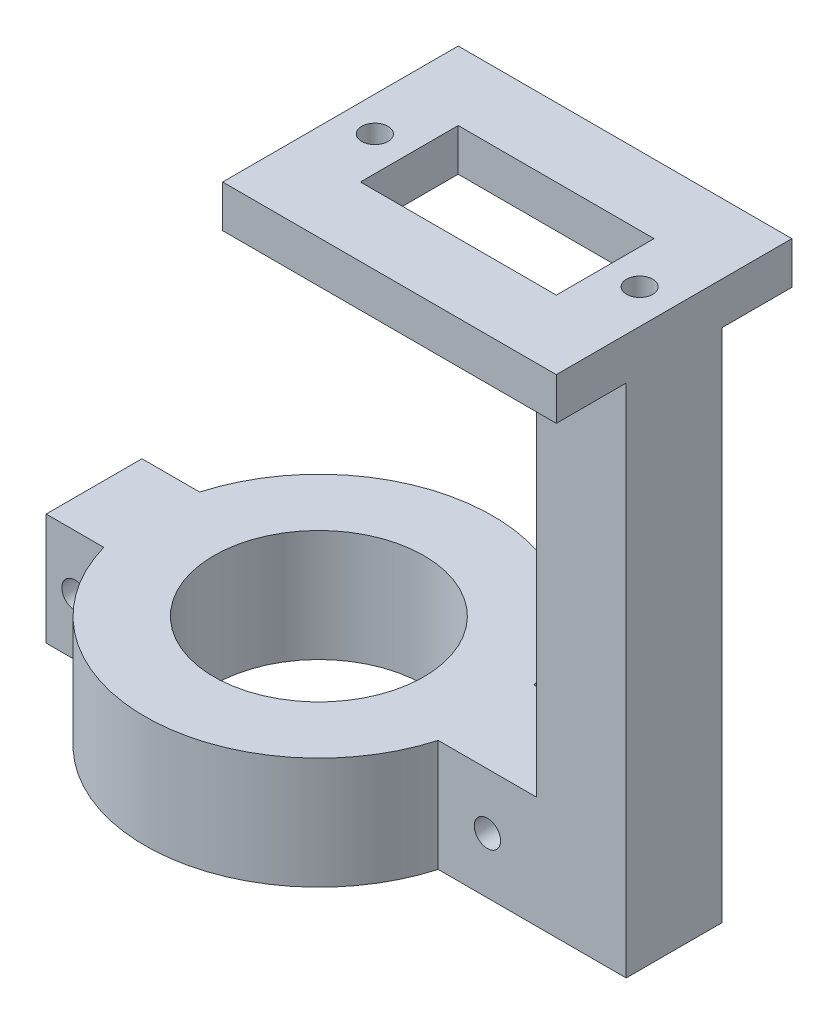
ISO-10303-21;
HEADER;
FILE_DESCRIPTION(('STEP AP214'),'2;1');
FILE_NAME('part.step','',(''),(''),'','','');
FILE_SCHEMA(('AUTOMOTIVE_DESIGN { 1 0 10303 214 1 1 1 1 }'));
ENDSEC;
DATA;
#1=APPLICATION_CONTEXT('core data for automotive mechanical design processes');
#2=APPLICATION_PROTOCOL_DEFINITION('international standard','automotive_design',2000,#1);
#3=PRODUCT_CONTEXT('',#1,'mechanical');
#4=PRODUCT('Part','Part','',(#3));
#5=PRODUCT_RELATED_PRODUCT_CATEGORY('part','',(#4));
#6=PRODUCT_DEFINITION_FORMATION('','',#4);
#7=PRODUCT_DEFINITION_CONTEXT('part definition',#1,'design');
#8=PRODUCT_DEFINITION('design','',#6,#7);
#9=PRODUCT_DEFINITION_SHAPE('','',#8);
#10=(LENGTH_UNIT() NAMED_UNIT(*) SI_UNIT(.MILLI.,.METRE.));
#11=(NAMED_UNIT(*) PLANE_ANGLE_UNIT() SI_UNIT($,.RADIAN.));
#12=(NAMED_UNIT(*) SI_UNIT($,.STERADIAN.) SOLID_ANGLE_UNIT());
#13=UNCERTAINTY_MEASURE_WITH_UNIT(LENGTH_MEASURE(1.E-05),#10,'distance_accuracy_value','');
#14=(GEOMETRIC_REPRESENTATION_CONTEXT(3) GLOBAL_UNCERTAINTY_ASSIGNED_CONTEXT((#13)) GLOBAL_UNIT_ASSIGNED_CONTEXT((#10,
#11,#12)) REPRESENTATION_CONTEXT('',''));
#15=CARTESIAN_POINT('',(0.,0.,0.));
#16=DIRECTION('',(0.,0.,1.));
#17=DIRECTION('',(1.,0.,0.));
#18=AXIS2_PLACEMENT_3D('',#15,#16,#17);
#19=CARTESIAN_POINT('',(-27.351479578733,-58.59,0.));
#20=DIRECTION('',(0.,-1.,0.));
#21=DIRECTION('',(0.,0.,-1.));
#22=AXIS2_PLACEMENT_3D('',#19,#20,#21);
#23=CYLINDRICAL_SURFACE('',#22,25.25);
#24=CARTESIAN_POINT('',(-27.351479578733,-74.82,0.));
#25=DIRECTION('',(0.,-1.,0.));
#26=DIRECTION('',(1.,0.,0.));
#27=AXIS2_PLACEMENT_3D('',#24,#25,#26);
#28=CIRCLE('',#27,25.25);
#29=CARTESIAN_POINT('',(-51.6247256533725,-74.82,-6.955));
#30=VERTEX_POINT('',#29);
#31=CARTESIAN_POINT('',(-3.07823350409353,-74.82,-6.955));
#32=VERTEX_POINT('',#31);
#33=EDGE_CURVE('E266',#30,#32,#28,.T.);
#34=ORIENTED_EDGE('',*,*,#33,.F.);
#35=DIRECTION('',(0.,-1.,0.));
#36=VECTOR('',#35,1.);
#37=CARTESIAN_POINT('',(-51.6247256533725,-58.59,-6.955));
#38=LINE('',#37,#36);
#39=CARTESIAN_POINT('',(-51.6247256533725,-58.59,-6.955));
#40=VERTEX_POINT('',#39);
#41=EDGE_CURVE('E12',#30,#40,#38,.F.);
#42=ORIENTED_EDGE('',*,*,#41,.T.);
#43=CARTESIAN_POINT('',(-27.351479578733,-58.59,0.));
#44=DIRECTION('',(0.,-1.,0.));
#45=DIRECTION('',(1.,0.,0.));
#46=AXIS2_PLACEMENT_3D('',#43,#44,#45);
#47=CIRCLE('',#46,25.25);
#48=CARTESIAN_POINT('',(-3.07823350409353,-58.59,-6.95500000000001));
#49=VERTEX_POINT('',#48);
#50=EDGE_CURVE('E273',#40,#49,#47,.T.);
#51=ORIENTED_EDGE('',*,*,#50,.T.);
#52=DIRECTION('',(0.,-1.,0.));
#53=VECTOR('',#52,1.);
#54=CARTESIAN_POINT('',(-3.07823350409353,-58.59,-6.955));
#55=LINE('',#54,#53);
#56=EDGE_CURVE('E278',#32,#49,#55,.F.);
#57=ORIENTED_EDGE('',*,*,#56,.F.);
#58=EDGE_LOOP('',(#34,#42,#51,#57));
#59=FACE_BOUND('',#58,.T.);
#60=ADVANCED_FACE('F63',(#59),#23,.T.);
#61=CARTESIAN_POINT('',(-3.07823350409353,-58.59,6.95499999999999));
#62=VERTEX_POINT('',#61);
#63=CARTESIAN_POINT('',(-51.6247256533725,-58.59,6.955));
#64=VERTEX_POINT('',#63);
#65=EDGE_CURVE('E269',#62,#64,#47,.T.);
#66=ORIENTED_EDGE('',*,*,#65,.T.);
#67=DIRECTION('',(0.,-1.,0.));
#68=VECTOR('',#67,1.);
#69=CARTESIAN_POINT('',(-51.6247256533725,-58.59,6.955));
#70=LINE('',#69,#68);
#71=CARTESIAN_POINT('',(-51.6247256533725,-74.82,6.955));
#72=VERTEX_POINT('',#71);
#73=EDGE_CURVE('E72',#64,#72,#70,.T.);
#74=ORIENTED_EDGE('',*,*,#73,.T.);
#75=CARTESIAN_POINT('',(-3.07823350409353,-74.82,6.955));
#76=VERTEX_POINT('',#75);
#77=EDGE_CURVE('E274',#76,#72,#28,.T.);
#78=ORIENTED_EDGE('',*,*,#77,.F.);
#79=DIRECTION('',(0.,-1.,0.));
#80=VECTOR('',#79,1.);
#81=CARTESIAN_POINT('',(-3.07823350409353,-58.59,6.955));
#82=LINE('',#81,#80);
#83=EDGE_CURVE('E272',#62,#76,#82,.T.);
#84=ORIENTED_EDGE('',*,*,#83,.F.);
#85=EDGE_LOOP('',(#66,#74,#78,#84));
#86=FACE_BOUND('',#85,.T.);
#87=ADVANCED_FACE('F404',(#86),#23,.T.);
#88=CARTESIAN_POINT('',(11.225,-74.82,6.955));
#89=DIRECTION('',(1.,0.,0.));
#90=DIRECTION('',(0.,0.,-1.));
#91=AXIS2_PLACEMENT_3D('',#88,#89,#90);
#92=PLANE('',#91);
#93=DIRECTION('',(0.,0.,-1.));
#94=VECTOR('',#93,1.);
#95=CARTESIAN_POINT('',(11.225,-58.59,-6.955));
#96=LINE('',#95,#94);
#97=CARTESIAN_POINT('',(11.225,-58.59,6.955));
#98=VERTEX_POINT('',#97);
#99=CARTESIAN_POINT('',(11.225,-58.59,-6.955));
#100=VERTEX_POINT('',#99);
#101=EDGE_CURVE('E281',#98,#100,#96,.T.);
#102=ORIENTED_EDGE('',*,*,#101,.F.);
#103=DIRECTION('',(0.,1.,0.));
#104=VECTOR('',#103,1.);
#105=CARTESIAN_POINT('',(11.225,-74.82,6.955));
#106=LINE('',#105,#104);
#107=CARTESIAN_POINT('',(11.225,0.,6.955));
#108=VERTEX_POINT('',#107);
#109=EDGE_CURVE('E308',#98,#108,#106,.T.);
#110=ORIENTED_EDGE('',*,*,#109,.T.);
#111=DIRECTION('',(0.,0.,-1.));
#112=VECTOR('',#111,1.);
#113=CARTESIAN_POINT('',(11.225,0.,6.955));
#114=LINE('',#113,#112);
#115=CARTESIAN_POINT('',(11.225,0.,-6.955));
#116=VERTEX_POINT('',#115);
#117=EDGE_CURVE('E301',#108,#116,#114,.T.);
#118=ORIENTED_EDGE('',*,*,#117,.T.);
#119=DIRECTION('',(0.,1.,0.));
#120=VECTOR('',#119,1.);
#121=CARTESIAN_POINT('',(11.225,-74.82,-6.955));
#122=LINE('',#121,#120);
#123=EDGE_CURVE('E306',#100,#116,#122,.T.);
#124=ORIENTED_EDGE('',*,*,#123,.F.);
#125=EDGE_LOOP('',(#102,#110,#118,#124));
#126=FACE_BOUND('',#125,.T.);
#127=ADVANCED_FACE('F394',(#126),#92,.F.);
#128=CARTESIAN_POINT('',(0.,0.,0.));
#129=DIRECTION('',(0.,1.,0.));
#130=DIRECTION('',(0.,0.,1.));
#131=AXIS2_PLACEMENT_3D('',#128,#129,#130);
#132=PLANE('',#131);
#133=CARTESIAN_POINT('',(-19.225,0.,0.));
#134=DIRECTION('',(0.,1.,0.));
#135=DIRECTION('',(0.,0.,1.));
#136=AXIS2_PLACEMENT_3D('',#133,#134,#135);
#137=CIRCLE('',#136,1.91);
#138=CARTESIAN_POINT('',(-19.225,0.,1.91));
#139=VERTEX_POINT('',#138);
#140=EDGE_CURVE('E316',#139,#139,#137,.T.);
#141=ORIENTED_EDGE('',*,*,#140,.T.);
#142=EDGE_LOOP('',(#141));
#143=FACE_BOUND('',#142,.T.);
#144=DIRECTION('',(1.,0.,0.));
#145=VECTOR('',#144,1.);
#146=CARTESIAN_POINT('',(11.225,0.,-6.955));
#147=LINE('',#146,#145);
#148=CARTESIAN_POINT('',(14.225,0.,-6.955));
#149=VERTEX_POINT('',#148);
#150=CARTESIAN_POINT('',(24.225,0.,-6.955));
#151=VERTEX_POINT('',#150);
#152=EDGE_CURVE('E214',#149,#151,#147,.T.);
#153=ORIENTED_EDGE('',*,*,#152,.F.);
#154=DIRECTION('',(0.,0.,-1.));
#155=VECTOR('',#154,1.);
#156=CARTESIAN_POINT('',(14.225,0.,-7.1));
#157=LINE('',#156,#155);
#158=CARTESIAN_POINT('',(14.225,0.,-7.1));
#159=VERTEX_POINT('',#158);
#160=EDGE_CURVE('E319',#149,#159,#157,.T.);
#161=ORIENTED_EDGE('',*,*,#160,.T.);
#162=DIRECTION('',(-1.,0.,0.));
#163=VECTOR('',#162,1.);
#164=CARTESIAN_POINT('',(-14.225,0.,-7.1));
#165=LINE('',#164,#163);
#166=CARTESIAN_POINT('',(-14.225,0.,-7.1));
#167=VERTEX_POINT('',#166);
#168=EDGE_CURVE('E322',#159,#167,#165,.T.);
#169=ORIENTED_EDGE('',*,*,#168,.T.);
#170=DIRECTION('',(0.,0.,1.));
#171=VECTOR('',#170,1.);
#172=CARTESIAN_POINT('',(-14.225,0.,-7.1));
#173=LINE('',#172,#171);
#174=CARTESIAN_POINT('',(-14.225,0.,7.1));
#175=VERTEX_POINT('',#174);
#176=EDGE_CURVE('E326',#167,#175,#173,.T.);
#177=ORIENTED_EDGE('',*,*,#176,.T.);
#178=DIRECTION('',(1.,0.,0.));
#179=VECTOR('',#178,1.);
#180=CARTESIAN_POINT('',(-14.225,0.,7.1));
#181=LINE('',#180,#179);
#182=CARTESIAN_POINT('',(14.225,0.,7.1));
#183=VERTEX_POINT('',#182);
#184=EDGE_CURVE('E329',#175,#183,#181,.T.);
#185=ORIENTED_EDGE('',*,*,#184,.T.);
#186=CARTESIAN_POINT('',(14.225,0.,6.955));
#187=VERTEX_POINT('',#186);
#188=EDGE_CURVE('E320',#183,#187,#157,.T.);
#189=ORIENTED_EDGE('',*,*,#188,.T.);
#190=DIRECTION('',(-1.,0.,0.));
#191=VECTOR('',#190,1.);
#192=CARTESIAN_POINT('',(11.225,0.,6.955));
#193=LINE('',#192,#191);
#194=CARTESIAN_POINT('',(24.225,0.,6.955));
#195=VERTEX_POINT('',#194);
#196=EDGE_CURVE('E298',#195,#187,#193,.T.);
#197=ORIENTED_EDGE('',*,*,#196,.F.);
#198=DIRECTION('',(0.,0.,-1.));
#199=VECTOR('',#198,1.);
#200=CARTESIAN_POINT('',(24.225,0.,-7.1));
#201=LINE('',#200,#199);
#202=CARTESIAN_POINT('',(24.225,0.,17.1));
#203=VERTEX_POINT('',#202);
#204=EDGE_CURVE('E340',#203,#195,#201,.T.);
#205=ORIENTED_EDGE('',*,*,#204,.F.);
#206=DIRECTION('',(1.,0.,0.));
#207=VECTOR('',#206,1.);
#208=CARTESIAN_POINT('',(-14.225,0.,17.1));
#209=LINE('',#208,#207);
#210=CARTESIAN_POINT('',(-24.225,0.,17.1));
#211=VERTEX_POINT('',#210);
#212=EDGE_CURVE('E348',#211,#203,#209,.T.);
#213=ORIENTED_EDGE('',*,*,#212,.F.);
#214=DIRECTION('',(0.,0.,1.));
#215=VECTOR('',#214,1.);
#216=CARTESIAN_POINT('',(-24.225,0.,-7.1));
#217=LINE('',#216,#215);
#218=CARTESIAN_POINT('',(-24.225,0.,-17.1));
#219=VERTEX_POINT('',#218);
#220=EDGE_CURVE('E345',#219,#211,#217,.T.);
#221=ORIENTED_EDGE('',*,*,#220,.F.);
#222=DIRECTION('',(-1.,0.,0.));
#223=VECTOR('',#222,1.);
#224=CARTESIAN_POINT('',(-14.225,0.,-17.1));
#225=LINE('',#224,#223);
#226=CARTESIAN_POINT('',(24.225,0.,-17.1));
#227=VERTEX_POINT('',#226);
#228=EDGE_CURVE('E343',#227,#219,#225,.T.);
#229=ORIENTED_EDGE('',*,*,#228,.F.);
#230=EDGE_CURVE('E212',#151,#227,#201,.T.);
#231=ORIENTED_EDGE('',*,*,#230,.F.);
#232=EDGE_LOOP('',(#153,#161,#169,#177,#185,#189,#197,#205,#213,#221,#229,#231));
#233=FACE_BOUND('',#232,.T.);
#234=ADVANCED_FACE('F361',(#143,#233),#132,.F.);
#235=CARTESIAN_POINT('',(24.225,12.25,-7.1));
#236=DIRECTION('',(-1.,0.,0.));
#237=DIRECTION('',(0.,0.,1.));
#238=AXIS2_PLACEMENT_3D('',#235,#236,#237);
#239=PLANE('',#238);
#240=DIRECTION('',(0.,-1.,0.));
#241=VECTOR('',#240,1.);
#242=CARTESIAN_POINT('',(24.225,12.25,-17.1));
#243=LINE('',#242,#241);
#244=CARTESIAN_POINT('',(24.225,6.125,-17.1));
#245=VERTEX_POINT('',#244);
#246=EDGE_CURVE('E200',#245,#227,#243,.T.);
#247=ORIENTED_EDGE('',*,*,#246,.F.);
#248=DIRECTION('',(0.,0.,1.));
#249=VECTOR('',#248,1.);
#250=CARTESIAN_POINT('',(24.225,6.125,-7.1));
#251=LINE('',#250,#249);
#252=CARTESIAN_POINT('',(24.225,6.125,17.1));
#253=VERTEX_POINT('',#252);
#254=EDGE_CURVE('E203',#245,#253,#251,.T.);
#255=ORIENTED_EDGE('',*,*,#254,.T.);
#256=DIRECTION('',(0.,-1.,0.));
#257=VECTOR('',#256,1.);
#258=CARTESIAN_POINT('',(24.225,12.25,17.1));
#259=LINE('',#258,#257);
#260=EDGE_CURVE('E351',#253,#203,#259,.T.);
#261=ORIENTED_EDGE('',*,*,#260,.T.);
#262=ORIENTED_EDGE('',*,*,#204,.T.);
#263=DIRECTION('',(0.,1.,0.));
#264=VECTOR('',#263,1.);
#265=CARTESIAN_POINT('',(24.225,-74.82,6.955));
#266=LINE('',#265,#264);
#267=CARTESIAN_POINT('',(24.225,-74.82,6.955));
#268=VERTEX_POINT('',#267);
#269=EDGE_CURVE('E310',#268,#195,#266,.T.);
#270=ORIENTED_EDGE('',*,*,#269,.F.);
#271=DIRECTION('',(0.,0.,1.));
#272=VECTOR('',#271,1.);
#273=CARTESIAN_POINT('',(24.225,-74.82,6.955));
#274=LINE('',#273,#272);
#275=CARTESIAN_POINT('',(24.225,-74.82,-6.955));
#276=VERTEX_POINT('',#275);
#277=EDGE_CURVE('E289',#276,#268,#274,.T.);
#278=ORIENTED_EDGE('',*,*,#277,.F.);
#279=DIRECTION('',(0.,1.,0.));
#280=VECTOR('',#279,1.);
#281=CARTESIAN_POINT('',(24.225,-74.82,-6.955));
#282=LINE('',#281,#280);
#283=EDGE_CURVE('E297',#276,#151,#282,.T.);
#284=ORIENTED_EDGE('',*,*,#283,.T.);
#285=ORIENTED_EDGE('',*,*,#230,.T.);
#286=EDGE_LOOP('',(#247,#255,#261,#262,#270,#278,#284,#285));
#287=FACE_BOUND('',#286,.T.);
#288=ADVANCED_FACE('F65',(#287),#239,.F.);
#289=CARTESIAN_POINT('',(-14.225,12.25,-17.1));
#290=DIRECTION('',(0.,0.,1.));
#291=DIRECTION('',(1.,0.,0.));
#292=AXIS2_PLACEMENT_3D('',#289,#290,#291);
#293=PLANE('',#292);
#294=DIRECTION('',(-1.,0.,0.));
#295=VECTOR('',#294,1.);
#296=CARTESIAN_POINT('',(24.2045446236148,6.125,-17.1));
#297=LINE('',#296,#295);
#298=CARTESIAN_POINT('',(-24.225,6.125,-17.1));
#299=VERTEX_POINT('',#298);
#300=EDGE_CURVE('E195',#245,#299,#297,.T.);
#301=ORIENTED_EDGE('',*,*,#300,.F.);
#302=ORIENTED_EDGE('',*,*,#246,.T.);
#303=ORIENTED_EDGE('',*,*,#228,.T.);
#304=DIRECTION('',(0.,-1.,0.));
#305=VECTOR('',#304,1.);
#306=CARTESIAN_POINT('',(-24.225,12.25,-17.1));
#307=LINE('',#306,#305);
#308=EDGE_CURVE('E202',#299,#219,#307,.T.);
#309=ORIENTED_EDGE('',*,*,#308,.F.);
#310=EDGE_LOOP('',(#301,#302,#303,#309));
#311=FACE_BOUND('',#310,.T.);
#312=ADVANCED_FACE('F197',(#311),#293,.F.);
#313=CARTESIAN_POINT('',(-24.225,12.25,-7.1));
#314=DIRECTION('',(1.,0.,0.));
#315=DIRECTION('',(0.,0.,-1.));
#316=AXIS2_PLACEMENT_3D('',#313,#314,#315);
#317=PLANE('',#316);
#318=DIRECTION('',(0.,-1.,0.));
#319=VECTOR('',#318,1.);
#320=CARTESIAN_POINT('',(-24.225,12.25,17.1));
#321=LINE('',#320,#319);
#322=CARTESIAN_POINT('',(-24.225,6.125,17.1));
#323=VERTEX_POINT('',#322);
#324=EDGE_CURVE('E219',#323,#211,#321,.T.);
#325=ORIENTED_EDGE('',*,*,#324,.F.);
#326=DIRECTION('',(0.,0.,-1.));
#327=VECTOR('',#326,1.);
#328=CARTESIAN_POINT('',(-24.225,6.125,25.25));
#329=LINE('',#328,#327);
#330=EDGE_CURVE('E80',#323,#299,#329,.T.);
#331=ORIENTED_EDGE('',*,*,#330,.T.);
#332=ORIENTED_EDGE('',*,*,#308,.T.);
#333=ORIENTED_EDGE('',*,*,#220,.T.);
#334=EDGE_LOOP('',(#325,#331,#332,#333));
#335=FACE_BOUND('',#334,.T.);
#336=ADVANCED_FACE('F359',(#335),#317,.F.);
#337=CARTESIAN_POINT('',(-14.225,12.25,17.1));
#338=DIRECTION('',(0.,0.,-1.));
#339=DIRECTION('',(-1.,0.,0.));
#340=AXIS2_PLACEMENT_3D('',#337,#338,#339);
#341=PLANE('',#340);
#342=ORIENTED_EDGE('',*,*,#260,.F.);
#343=DIRECTION('',(-1.,0.,0.));
#344=VECTOR('',#343,1.);
#345=CARTESIAN_POINT('',(-14.225,6.125,17.1));
#346=LINE('',#345,#344);
#347=EDGE_CURVE('E207',#253,#323,#346,.T.);
#348=ORIENTED_EDGE('',*,*,#347,.T.);
#349=ORIENTED_EDGE('',*,*,#324,.T.);
#350=ORIENTED_EDGE('',*,*,#212,.T.);
#351=EDGE_LOOP('',(#342,#348,#349,#350));
#352=FACE_BOUND('',#351,.T.);
#353=ADVANCED_FACE('F354',(#352),#341,.F.);
#354=CARTESIAN_POINT('',(14.225,12.25,-7.1));
#355=DIRECTION('',(-1.,0.,0.));
#356=DIRECTION('',(0.,0.,1.));
#357=AXIS2_PLACEMENT_3D('',#354,#355,#356);
#358=PLANE('',#357);
#359=DIRECTION('',(0.,0.,1.));
#360=VECTOR('',#359,1.);
#361=CARTESIAN_POINT('',(14.225,6.125,-7.1));
#362=LINE('',#361,#360);
#363=CARTESIAN_POINT('',(14.225,6.125,-7.1));
#364=VERTEX_POINT('',#363);
#365=CARTESIAN_POINT('',(14.225,6.125,7.1));
#366=VERTEX_POINT('',#365);
#367=EDGE_CURVE('E88',#364,#366,#362,.T.);
#368=ORIENTED_EDGE('',*,*,#367,.F.);
#369=DIRECTION('',(0.,-1.,0.));
#370=VECTOR('',#369,1.);
#371=CARTESIAN_POINT('',(14.225,12.25,-7.1));
#372=LINE('',#371,#370);
#373=EDGE_CURVE('E338',#364,#159,#372,.T.);
#374=ORIENTED_EDGE('',*,*,#373,.T.);
#375=ORIENTED_EDGE('',*,*,#160,.F.);
#376=EDGE_CURVE('E323',#187,#149,#157,.T.);
#377=ORIENTED_EDGE('',*,*,#376,.F.);
#378=ORIENTED_EDGE('',*,*,#188,.F.);
#379=DIRECTION('',(0.,-1.,0.));
#380=VECTOR('',#379,1.);
#381=CARTESIAN_POINT('',(14.225,12.25,7.1));
#382=LINE('',#381,#380);
#383=EDGE_CURVE('E332',#366,#183,#382,.T.);
#384=ORIENTED_EDGE('',*,*,#383,.F.);
#385=EDGE_LOOP('',(#368,#374,#375,#377,#378,#384));
#386=FACE_BOUND('',#385,.T.);
#387=ADVANCED_FACE('F384',(#386),#358,.T.);
#388=CARTESIAN_POINT('',(-14.225,12.25,-7.1));
#389=DIRECTION('',(0.,0.,1.));
#390=DIRECTION('',(1.,0.,0.));
#391=AXIS2_PLACEMENT_3D('',#388,#389,#390);
#392=PLANE('',#391);
#393=DIRECTION('',(1.,0.,0.));
#394=VECTOR('',#393,1.);
#395=CARTESIAN_POINT('',(-14.225,6.125,-7.1));
#396=LINE('',#395,#394);
#397=CARTESIAN_POINT('',(-14.225,6.125,-7.1));
#398=VERTEX_POINT('',#397);
#399=EDGE_CURVE('E692',#398,#364,#396,.T.);
#400=ORIENTED_EDGE('',*,*,#399,.F.);
#401=DIRECTION('',(0.,-1.,0.));
#402=VECTOR('',#401,1.);
#403=CARTESIAN_POINT('',(-14.225,12.25,-7.1));
#404=LINE('',#403,#402);
#405=EDGE_CURVE('E336',#398,#167,#404,.T.);
#406=ORIENTED_EDGE('',*,*,#405,.T.);
#407=ORIENTED_EDGE('',*,*,#168,.F.);
#408=ORIENTED_EDGE('',*,*,#373,.F.);
#409=EDGE_LOOP('',(#400,#406,#407,#408));
#410=FACE_BOUND('',#409,.T.);
#411=ADVANCED_FACE('F458',(#410),#392,.T.);
#412=CARTESIAN_POINT('',(-14.225,12.25,-7.1));
#413=DIRECTION('',(1.,0.,0.));
#414=DIRECTION('',(0.,0.,-1.));
#415=AXIS2_PLACEMENT_3D('',#412,#413,#414);
#416=PLANE('',#415);
#417=DIRECTION('',(0.,0.,-1.));
#418=VECTOR('',#417,1.);
#419=CARTESIAN_POINT('',(-14.225,6.125,-7.1));
#420=LINE('',#419,#418);
#421=CARTESIAN_POINT('',(-14.225,6.125,7.1));
#422=VERTEX_POINT('',#421);
#423=EDGE_CURVE('E687',#422,#398,#420,.T.);
#424=ORIENTED_EDGE('',*,*,#423,.F.);
#425=DIRECTION('',(0.,-1.,0.));
#426=VECTOR('',#425,1.);
#427=CARTESIAN_POINT('',(-14.225,12.25,7.1));
#428=LINE('',#427,#426);
#429=EDGE_CURVE('E334',#422,#175,#428,.T.);
#430=ORIENTED_EDGE('',*,*,#429,.T.);
#431=ORIENTED_EDGE('',*,*,#176,.F.);
#432=ORIENTED_EDGE('',*,*,#405,.F.);
#433=EDGE_LOOP('',(#424,#430,#431,#432));
#434=FACE_BOUND('',#433,.T.);
#435=ADVANCED_FACE('F454',(#434),#416,.T.);
#436=CARTESIAN_POINT('',(-14.225,12.25,7.1));
#437=DIRECTION('',(0.,0.,-1.));
#438=DIRECTION('',(-1.,0.,0.));
#439=AXIS2_PLACEMENT_3D('',#436,#437,#438);
#440=PLANE('',#439);
#441=DIRECTION('',(-1.,0.,0.));
#442=VECTOR('',#441,1.);
#443=CARTESIAN_POINT('',(-14.225,6.125,7.1));
#444=LINE('',#443,#442);
#445=EDGE_CURVE('E685',#366,#422,#444,.T.);
#446=ORIENTED_EDGE('',*,*,#445,.F.);
#447=ORIENTED_EDGE('',*,*,#383,.T.);
#448=ORIENTED_EDGE('',*,*,#184,.F.);
#449=ORIENTED_EDGE('',*,*,#429,.F.);
#450=EDGE_LOOP('',(#446,#447,#448,#449));
#451=FACE_BOUND('',#450,.T.);
#452=ADVANCED_FACE('F450',(#451),#440,.T.);
#453=CARTESIAN_POINT('',(-19.225,0.,0.));
#454=DIRECTION('',(0.,1.,0.));
#455=DIRECTION('',(0.,0.,1.));
#456=AXIS2_PLACEMENT_3D('',#453,#454,#455);
#457=CYLINDRICAL_SURFACE('',#456,1.91);
#458=CARTESIAN_POINT('',(-19.225,6.125,0.));
#459=DIRECTION('',(0.,-1.,0.));
#460=DIRECTION('',(0.,0.,-1.));
#461=AXIS2_PLACEMENT_3D('',#458,#459,#460);
#462=CIRCLE('',#461,1.91);
#463=CARTESIAN_POINT('',(-19.225,6.125,-1.91));
#464=VERTEX_POINT('',#463);
#465=EDGE_CURVE('E684',#464,#464,#462,.F.);
#466=ORIENTED_EDGE('',*,*,#465,.T.);
#467=EDGE_LOOP('',(#466));
#468=FACE_BOUND('',#467,.T.);
#469=ORIENTED_EDGE('',*,*,#140,.F.);
#470=EDGE_LOOP('',(#469));
#471=FACE_BOUND('',#470,.T.);
#472=ADVANCED_FACE('F431',(#468,#471),#457,.F.);
#473=CARTESIAN_POINT('',(0.,-74.82,0.));
#474=DIRECTION('',(0.,-1.,0.));
#475=DIRECTION('',(0.,0.,-1.));
#476=AXIS2_PLACEMENT_3D('',#473,#474,#475);
#477=PLANE('',#476);
#478=DIRECTION('',(-1.,0.,0.));
#479=VECTOR('',#478,1.);
#480=CARTESIAN_POINT('',(-50.,-74.82,-6.955));
#481=LINE('',#480,#479);
#482=CARTESIAN_POINT('',(-60.,-74.82,-6.955));
#483=VERTEX_POINT('',#482);
#484=EDGE_CURVE('E253',#30,#483,#481,.T.);
#485=ORIENTED_EDGE('',*,*,#484,.F.);
#486=ORIENTED_EDGE('',*,*,#33,.T.);
#487=DIRECTION('',(1.,0.,0.));
#488=VECTOR('',#487,1.);
#489=CARTESIAN_POINT('',(11.225,-74.82,-6.955));
#490=LINE('',#489,#488);
#491=EDGE_CURVE('E295',#32,#276,#490,.T.);
#492=ORIENTED_EDGE('',*,*,#491,.T.);
#493=ORIENTED_EDGE('',*,*,#277,.T.);
#494=DIRECTION('',(-1.,0.,0.));
#495=VECTOR('',#494,1.);
#496=CARTESIAN_POINT('',(11.225,-74.82,6.955));
#497=LINE('',#496,#495);
#498=EDGE_CURVE('E292',#268,#76,#497,.T.);
#499=ORIENTED_EDGE('',*,*,#498,.T.);
#500=ORIENTED_EDGE('',*,*,#77,.T.);
#501=DIRECTION('',(-1.,0.,0.));
#502=VECTOR('',#501,1.);
#503=CARTESIAN_POINT('',(-50.,-74.82,6.955));
#504=LINE('',#503,#502);
#505=CARTESIAN_POINT('',(-60.,-74.82,6.955));
#506=VERTEX_POINT('',#505);
#507=EDGE_CURVE('E255',#72,#506,#504,.T.);
#508=ORIENTED_EDGE('',*,*,#507,.T.);
#509=DIRECTION('',(0.,0.,-1.));
#510=VECTOR('',#509,1.);
#511=CARTESIAN_POINT('',(-60.,-74.82,-6.955));
#512=LINE('',#511,#510);
#513=EDGE_CURVE('E250',#506,#483,#512,.T.);
#514=ORIENTED_EDGE('',*,*,#513,.T.);
#515=EDGE_LOOP('',(#485,#486,#492,#493,#499,#500,#508,#514));
#516=FACE_BOUND('',#515,.T.);
#517=CARTESIAN_POINT('',(-27.351479578733,-74.82,0.));
#518=DIRECTION('',(0.,-1.,0.));
#519=DIRECTION('',(0.,0.,-1.));
#520=AXIS2_PLACEMENT_3D('',#517,#518,#519);
#521=CIRCLE('',#520,15.25);
#522=CARTESIAN_POINT('',(-27.351479578733,-74.82,-15.25));
#523=VERTEX_POINT('',#522);
#524=EDGE_CURVE('E226',#523,#523,#521,.T.);
#525=ORIENTED_EDGE('',*,*,#524,.F.);
#526=EDGE_LOOP('',(#525));
#527=FACE_BOUND('',#526,.T.);
#528=ADVANCED_FACE('F370',(#516,#527),#477,.T.);
#529=CARTESIAN_POINT('',(11.225,-74.82,-6.955));
#530=DIRECTION('',(0.,0.,1.));
#531=DIRECTION('',(1.,0.,0.));
#532=AXIS2_PLACEMENT_3D('',#529,#530,#531);
#533=PLANE('',#532);
#534=CARTESIAN_POINT('',(4.07338324795324,-66.705,-6.955));
#535=DIRECTION('',(0.,0.,-1.));
#536=DIRECTION('',(-1.,0.,0.));
#537=AXIS2_PLACEMENT_3D('',#534,#535,#536);
#538=CIRCLE('',#537,1.91);
#539=CARTESIAN_POINT('',(2.16338324795324,-66.705,-6.955));
#540=VERTEX_POINT('',#539);
#541=EDGE_CURVE('E227',#540,#540,#538,.T.);
#542=ORIENTED_EDGE('',*,*,#541,.F.);
#543=EDGE_LOOP('',(#542));
#544=FACE_BOUND('',#543,.T.);
#545=ORIENTED_EDGE('',*,*,#491,.F.);
#546=ORIENTED_EDGE('',*,*,#56,.T.);
#547=DIRECTION('',(1.,0.,0.));
#548=VECTOR('',#547,1.);
#549=CARTESIAN_POINT('',(-4.77499999999998,-58.59,-6.95500000000001));
#550=LINE('',#549,#548);
#551=EDGE_CURVE('E284',#49,#100,#550,.T.);
#552=ORIENTED_EDGE('',*,*,#551,.T.);
#553=ORIENTED_EDGE('',*,*,#123,.T.);
#554=EDGE_CURVE('E218',#116,#149,#147,.T.);
#555=ORIENTED_EDGE('',*,*,#554,.T.);
#556=ORIENTED_EDGE('',*,*,#152,.T.);
#557=ORIENTED_EDGE('',*,*,#283,.F.);
#558=EDGE_LOOP('',(#545,#546,#552,#553,#555,#556,#557));
#559=FACE_BOUND('',#558,.T.);
#560=ADVANCED_FACE('F375',(#544,#559),#533,.F.);
#561=CARTESIAN_POINT('',(11.225,-74.82,6.955));
#562=DIRECTION('',(0.,0.,-1.));
#563=DIRECTION('',(-1.,0.,0.));
#564=AXIS2_PLACEMENT_3D('',#561,#562,#563);
#565=PLANE('',#564);
#566=CARTESIAN_POINT('',(4.07338324795324,-66.705,6.955));
#567=DIRECTION('',(0.,0.,-1.));
#568=DIRECTION('',(-1.,0.,0.));
#569=AXIS2_PLACEMENT_3D('',#566,#567,#568);
#570=CIRCLE('',#569,1.91);
#571=CARTESIAN_POINT('',(2.16338324795324,-66.705,6.955));
#572=VERTEX_POINT('',#571);
#573=EDGE_CURVE('E223',#572,#572,#570,.T.);
#574=ORIENTED_EDGE('',*,*,#573,.T.);
#575=EDGE_LOOP('',(#574));
#576=FACE_BOUND('',#575,.T.);
#577=DIRECTION('',(1.,0.,0.));
#578=VECTOR('',#577,1.);
#579=CARTESIAN_POINT('',(-4.77499999999999,-58.59,6.95499999999999));
#580=LINE('',#579,#578);
#581=EDGE_CURVE('E286',#62,#98,#580,.T.);
#582=ORIENTED_EDGE('',*,*,#581,.F.);
#583=ORIENTED_EDGE('',*,*,#83,.T.);
#584=ORIENTED_EDGE('',*,*,#498,.F.);
#585=ORIENTED_EDGE('',*,*,#269,.T.);
#586=ORIENTED_EDGE('',*,*,#196,.T.);
#587=EDGE_CURVE('E288',#187,#108,#193,.T.);
#588=ORIENTED_EDGE('',*,*,#587,.T.);
#589=ORIENTED_EDGE('',*,*,#109,.F.);
#590=EDGE_LOOP('',(#582,#583,#584,#585,#586,#588,#589));
#591=FACE_BOUND('',#590,.T.);
#592=ADVANCED_FACE('F365',(#576,#591),#565,.F.);
#593=CARTESIAN_POINT('',(0.,0.,0.));
#594=DIRECTION('',(0.,-1.,0.));
#595=DIRECTION('',(0.,0.,-1.));
#596=AXIS2_PLACEMENT_3D('',#593,#594,#595);
#597=PLANE('',#596);
#598=ORIENTED_EDGE('',*,*,#587,.F.);
#599=ORIENTED_EDGE('',*,*,#376,.T.);
#600=ORIENTED_EDGE('',*,*,#554,.F.);
#601=ORIENTED_EDGE('',*,*,#117,.F.);
#602=EDGE_LOOP('',(#598,#599,#600,#601));
#603=FACE_BOUND('',#602,.T.);
#604=ADVANCED_FACE('F389',(#603),#597,.F.);
#605=CARTESIAN_POINT('',(-4.77499999999998,-58.59,-6.95500000000001));
#606=DIRECTION('',(0.,-1.,0.));
#607=DIRECTION('',(0.,0.,-1.));
#608=AXIS2_PLACEMENT_3D('',#605,#606,#607);
#609=PLANE('',#608);
#610=ORIENTED_EDGE('',*,*,#50,.F.);
#611=DIRECTION('',(-1.,0.,0.));
#612=VECTOR('',#611,1.);
#613=CARTESIAN_POINT('',(-50.,-58.59,-6.955));
#614=LINE('',#613,#612);
#615=CARTESIAN_POINT('',(-60.,-58.59,-6.955));
#616=VERTEX_POINT('',#615);
#617=EDGE_CURVE('E259',#40,#616,#614,.T.);
#618=ORIENTED_EDGE('',*,*,#617,.T.);
#619=DIRECTION('',(0.,0.,1.));
#620=VECTOR('',#619,1.);
#621=CARTESIAN_POINT('',(-60.,-58.59,-6.955));
#622=LINE('',#621,#620);
#623=CARTESIAN_POINT('',(-60.,-58.59,6.955));
#624=VERTEX_POINT('',#623);
#625=EDGE_CURVE('E236',#616,#624,#622,.T.);
#626=ORIENTED_EDGE('',*,*,#625,.T.);
#627=DIRECTION('',(-1.,0.,0.));
#628=VECTOR('',#627,1.);
#629=CARTESIAN_POINT('',(-50.,-58.59,6.955));
#630=LINE('',#629,#628);
#631=EDGE_CURVE('E257',#64,#624,#630,.T.);
#632=ORIENTED_EDGE('',*,*,#631,.F.);
#633=ORIENTED_EDGE('',*,*,#65,.F.);
#634=ORIENTED_EDGE('',*,*,#581,.T.);
#635=ORIENTED_EDGE('',*,*,#101,.T.);
#636=ORIENTED_EDGE('',*,*,#551,.F.);
#637=EDGE_LOOP('',(#610,#618,#626,#632,#633,#634,#635,#636));
#638=FACE_BOUND('',#637,.T.);
#639=CARTESIAN_POINT('',(-27.351479578733,-58.59,0.));
#640=DIRECTION('',(0.,-1.,0.));
#641=DIRECTION('',(0.,0.,-1.));
#642=AXIS2_PLACEMENT_3D('',#639,#640,#641);
#643=CIRCLE('',#642,15.25);
#644=CARTESIAN_POINT('',(-27.351479578733,-58.59,-15.25));
#645=VERTEX_POINT('',#644);
#646=EDGE_CURVE('E263',#645,#645,#643,.T.);
#647=ORIENTED_EDGE('',*,*,#646,.T.);
#648=EDGE_LOOP('',(#647));
#649=FACE_BOUND('',#648,.T.);
#650=ADVANCED_FACE('F399',(#638,#649),#609,.F.);
#651=CARTESIAN_POINT('',(-27.351479578733,-58.59,0.));
#652=DIRECTION('',(0.,-1.,0.));
#653=DIRECTION('',(0.,0.,-1.));
#654=AXIS2_PLACEMENT_3D('',#651,#652,#653);
#655=CYLINDRICAL_SURFACE('',#654,15.25);
#656=ORIENTED_EDGE('',*,*,#646,.F.);
#657=EDGE_LOOP('',(#656));
#658=FACE_BOUND('',#657,.T.);
#659=ORIENTED_EDGE('',*,*,#524,.T.);
#660=EDGE_LOOP('',(#659));
#661=FACE_BOUND('',#660,.T.);
#662=ADVANCED_FACE('F425',(#658,#661),#655,.F.);
#663=CARTESIAN_POINT('',(4.07338324795324,-66.705,25.25));
#664=DIRECTION('',(0.,0.,-1.));
#665=DIRECTION('',(-1.,0.,0.));
#666=AXIS2_PLACEMENT_3D('',#663,#664,#665);
#667=CYLINDRICAL_SURFACE('',#666,1.91);
#668=ORIENTED_EDGE('',*,*,#541,.T.);
#669=EDGE_LOOP('',(#668));
#670=FACE_BOUND('',#669,.T.);
#671=ORIENTED_EDGE('',*,*,#573,.F.);
#672=EDGE_LOOP('',(#671));
#673=FACE_BOUND('',#672,.T.);
#674=ADVANCED_FACE('F534',(#670,#673),#667,.F.);
#675=CARTESIAN_POINT('',(-50.,-58.59,-6.955));
#676=DIRECTION('',(0.,0.,1.));
#677=DIRECTION('',(1.,0.,0.));
#678=AXIS2_PLACEMENT_3D('',#675,#676,#677);
#679=PLANE('',#678);
#680=CARTESIAN_POINT('',(-55.8123628266859,-66.7050000000066,-6.955));
#681=DIRECTION('',(0.,0.,-1.));
#682=DIRECTION('',(-1.,0.,0.));
#683=AXIS2_PLACEMENT_3D('',#680,#681,#682);
#684=CIRCLE('',#683,1.91);
#685=CARTESIAN_POINT('',(-57.7223628266859,-66.7050000000066,-6.955));
#686=VERTEX_POINT('',#685);
#687=EDGE_CURVE('E232',#686,#686,#684,.T.);
#688=ORIENTED_EDGE('',*,*,#687,.F.);
#689=EDGE_LOOP('',(#688));
#690=FACE_BOUND('',#689,.T.);
#691=ORIENTED_EDGE('',*,*,#41,.F.);
#692=ORIENTED_EDGE('',*,*,#484,.T.);
#693=DIRECTION('',(0.,1.,0.));
#694=VECTOR('',#693,1.);
#695=CARTESIAN_POINT('',(-60.,-58.59,-6.955));
#696=LINE('',#695,#694);
#697=EDGE_CURVE('E231',#483,#616,#696,.T.);
#698=ORIENTED_EDGE('',*,*,#697,.T.);
#699=ORIENTED_EDGE('',*,*,#617,.F.);
#700=EDGE_LOOP('',(#691,#692,#698,#699));
#701=FACE_BOUND('',#700,.T.);
#702=ADVANCED_FACE('F415',(#690,#701),#679,.F.);
#703=CARTESIAN_POINT('',(-50.,-58.59,6.955));
#704=DIRECTION('',(0.,0.,-1.));
#705=DIRECTION('',(-1.,0.,0.));
#706=AXIS2_PLACEMENT_3D('',#703,#704,#705);
#707=PLANE('',#706);
#708=CARTESIAN_POINT('',(-55.8123628266859,-66.7050000000066,6.955));
#709=DIRECTION('',(0.,0.,-1.));
#710=DIRECTION('',(-1.,0.,0.));
#711=AXIS2_PLACEMENT_3D('',#708,#709,#710);
#712=CIRCLE('',#711,1.91);
#713=CARTESIAN_POINT('',(-57.7223628266859,-66.7050000000066,6.955));
#714=VERTEX_POINT('',#713);
#715=EDGE_CURVE('E229',#714,#714,#712,.T.);
#716=ORIENTED_EDGE('',*,*,#715,.T.);
#717=EDGE_LOOP('',(#716));
#718=FACE_BOUND('',#717,.T.);
#719=ORIENTED_EDGE('',*,*,#73,.F.);
#720=ORIENTED_EDGE('',*,*,#631,.T.);
#721=DIRECTION('',(0.,-1.,0.));
#722=VECTOR('',#721,1.);
#723=CARTESIAN_POINT('',(-60.,-58.59,6.955));
#724=LINE('',#723,#722);
#725=EDGE_CURVE('E247',#624,#506,#724,.T.);
#726=ORIENTED_EDGE('',*,*,#725,.T.);
#727=ORIENTED_EDGE('',*,*,#507,.F.);
#728=EDGE_LOOP('',(#719,#720,#726,#727));
#729=FACE_BOUND('',#728,.T.);
#730=ADVANCED_FACE('F409',(#718,#729),#707,.F.);
#731=CARTESIAN_POINT('',(-60.,0.,0.));
#732=DIRECTION('',(-1.,0.,0.));
#733=DIRECTION('',(0.,0.,1.));
#734=AXIS2_PLACEMENT_3D('',#731,#732,#733);
#735=PLANE('',#734);
#736=ORIENTED_EDGE('',*,*,#697,.F.);
#737=ORIENTED_EDGE('',*,*,#513,.F.);
#738=ORIENTED_EDGE('',*,*,#725,.F.);
#739=ORIENTED_EDGE('',*,*,#625,.F.);
#740=EDGE_LOOP('',(#736,#737,#738,#739));
#741=FACE_BOUND('',#740,.T.);
#742=ADVANCED_FACE('F412',(#741),#735,.T.);
#743=CARTESIAN_POINT('',(-55.8123628266859,-66.7050000000066,25.25));
#744=DIRECTION('',(0.,0.,-1.));
#745=DIRECTION('',(-1.,0.,0.));
#746=AXIS2_PLACEMENT_3D('',#743,#744,#745);
#747=CYLINDRICAL_SURFACE('',#746,1.91);
#748=ORIENTED_EDGE('',*,*,#687,.T.);
#749=EDGE_LOOP('',(#748));
#750=FACE_BOUND('',#749,.T.);
#751=ORIENTED_EDGE('',*,*,#715,.F.);
#752=EDGE_LOOP('',(#751));
#753=FACE_BOUND('',#752,.T.);
#754=ADVANCED_FACE('F509',(#750,#753),#747,.F.);
#755=CARTESIAN_POINT('',(24.2045446236148,6.125,25.25));
#756=DIRECTION('',(0.,-1.,0.));
#757=DIRECTION('',(0.,0.,-1.));
#758=AXIS2_PLACEMENT_3D('',#755,#756,#757);
#759=PLANE('',#758);
#760=ORIENTED_EDGE('',*,*,#367,.T.);
#761=ORIENTED_EDGE('',*,*,#445,.T.);
#762=ORIENTED_EDGE('',*,*,#423,.T.);
#763=ORIENTED_EDGE('',*,*,#399,.T.);
#764=EDGE_LOOP('',(#760,#761,#762,#763));
#765=FACE_BOUND('',#764,.T.);
#766=CARTESIAN_POINT('',(19.225,6.125,0.));
#767=DIRECTION('',(0.,-1.,0.));
#768=DIRECTION('',(0.,0.,-1.));
#769=AXIS2_PLACEMENT_3D('',#766,#767,#768);
#770=CIRCLE('',#769,1.91);
#771=CARTESIAN_POINT('',(19.225,6.125,-1.91));
#772=VERTEX_POINT('',#771);
#773=EDGE_CURVE('E67',#772,#772,#770,.F.);
#774=ORIENTED_EDGE('',*,*,#773,.F.);
#775=EDGE_LOOP('',(#774));
#776=FACE_BOUND('',#775,.T.);
#777=ORIENTED_EDGE('',*,*,#465,.F.);
#778=EDGE_LOOP('',(#777));
#779=FACE_BOUND('',#778,.T.);
#780=ORIENTED_EDGE('',*,*,#347,.F.);
#781=ORIENTED_EDGE('',*,*,#254,.F.);
#782=ORIENTED_EDGE('',*,*,#300,.T.);
#783=ORIENTED_EDGE('',*,*,#330,.F.);
#784=EDGE_LOOP('',(#780,#781,#782,#783));
#785=FACE_BOUND('',#784,.T.);
#786=ADVANCED_FACE('F206',(#765,#776,#779,#785),#759,.F.);
#787=CARTESIAN_POINT('',(19.225,0.,0.));
#788=DIRECTION('',(0.,1.,0.));
#789=DIRECTION('',(0.,0.,1.));
#790=AXIS2_PLACEMENT_3D('',#787,#788,#789);
#791=CIRCLE('',#790,1.91);
#792=CARTESIAN_POINT('',(19.225,0.,1.91));
#793=VERTEX_POINT('',#792);
#794=EDGE_CURVE('E313',#793,#793,#791,.T.);
#795=ORIENTED_EDGE('',*,*,#794,.T.);
#796=EDGE_LOOP('',(#795));
#797=FACE_BOUND('',#796,.T.);
#798=ADVANCED_FACE('F432',(#797),#597,.F.);
#799=CARTESIAN_POINT('',(19.225,0.,0.));
#800=DIRECTION('',(0.,1.,0.));
#801=DIRECTION('',(0.,0.,1.));
#802=AXIS2_PLACEMENT_3D('',#799,#800,#801);
#803=CYLINDRICAL_SURFACE('',#802,1.91);
#804=ORIENTED_EDGE('',*,*,#773,.T.);
#805=EDGE_LOOP('',(#804));
#806=FACE_BOUND('',#805,.T.);
#807=ORIENTED_EDGE('',*,*,#794,.F.);
#808=EDGE_LOOP('',(#807));
#809=FACE_BOUND('',#808,.T.);
#810=ADVANCED_FACE('F435',(#806,#809),#803,.F.);
#811=CLOSED_SHELL('',(#60,#87,#127,#234,#288,#312,#336,#353,#387,#411,#435,#452,#472,#528,#560,
#592,#604,#650,#662,#674,#702,#730,#742,#754,#786,#798,#810));
#812=MANIFOLD_SOLID_BREP('B2',#811);
#813=ADVANCED_BREP_SHAPE_REPRESENTATION('',(#18,#812),#14);
#814=SHAPE_DEFINITION_REPRESENTATION(#9,#813);
ENDSEC;
END-ISO-10303-21;
